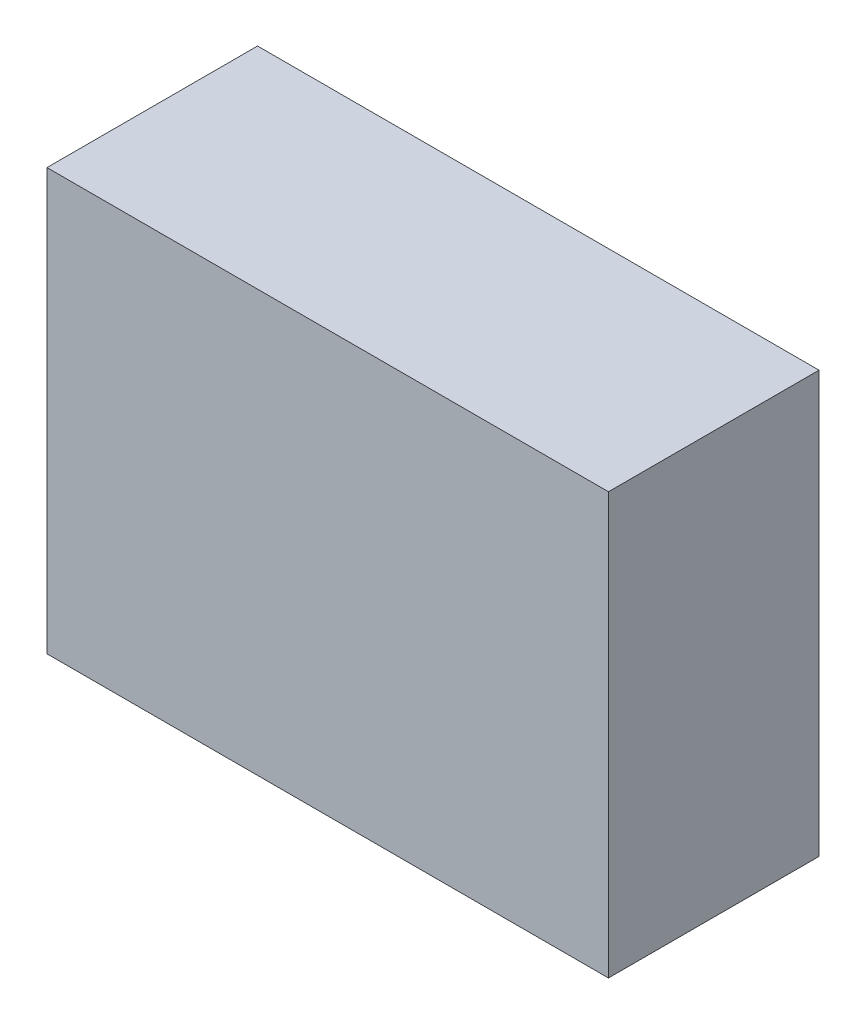
ISO-10303-21;
HEADER;
FILE_DESCRIPTION(('STEP AP214'),'2;1');
FILE_NAME('part.step','',(''),(''),'','','');
FILE_SCHEMA(('AUTOMOTIVE_DESIGN { 1 0 10303 214 1 1 1 1 }'));
ENDSEC;
DATA;
#1=APPLICATION_CONTEXT('core data for automotive mechanical design processes');
#2=APPLICATION_PROTOCOL_DEFINITION('international standard','automotive_design',2000,#1);
#3=PRODUCT_CONTEXT('',#1,'mechanical');
#4=PRODUCT('Part','Part','',(#3));
#5=PRODUCT_RELATED_PRODUCT_CATEGORY('part','',(#4));
#6=PRODUCT_DEFINITION_FORMATION('','',#4);
#7=PRODUCT_DEFINITION_CONTEXT('part definition',#1,'design');
#8=PRODUCT_DEFINITION('design','',#6,#7);
#9=PRODUCT_DEFINITION_SHAPE('','',#8);
#10=(LENGTH_UNIT() NAMED_UNIT(*) SI_UNIT(.MILLI.,.METRE.));
#11=(NAMED_UNIT(*) PLANE_ANGLE_UNIT() SI_UNIT($,.RADIAN.));
#12=(NAMED_UNIT(*) SI_UNIT($,.STERADIAN.) SOLID_ANGLE_UNIT());
#13=UNCERTAINTY_MEASURE_WITH_UNIT(LENGTH_MEASURE(1.E-05),#10,'distance_accuracy_value','');
#14=(GEOMETRIC_REPRESENTATION_CONTEXT(3) GLOBAL_UNCERTAINTY_ASSIGNED_CONTEXT((#13)) GLOBAL_UNIT_ASSIGNED_CONTEXT((#10,
#11,#12)) REPRESENTATION_CONTEXT('',''));
#15=CARTESIAN_POINT('',(0.,0.,0.));
#16=DIRECTION('',(0.,0.,1.));
#17=DIRECTION('',(1.,0.,0.));
#18=AXIS2_PLACEMENT_3D('',#15,#16,#17);
#19=CARTESIAN_POINT('',(4000.,-3000.,3000.));
#20=DIRECTION('',(-1.,0.,0.));
#21=DIRECTION('',(0.,0.,1.));
#22=AXIS2_PLACEMENT_3D('',#19,#20,#21);
#23=PLANE('',#22);
#24=DIRECTION('',(0.,1.,0.));
#25=VECTOR('',#24,1.);
#26=CARTESIAN_POINT('',(4000.,-3000.,0.));
#27=LINE('',#26,#25);
#28=CARTESIAN_POINT('',(4000.,-3000.,0.));
#29=VERTEX_POINT('',#28);
#30=CARTESIAN_POINT('',(4000.,3000.,0.));
#31=VERTEX_POINT('',#30);
#32=EDGE_CURVE('E104',#29,#31,#27,.T.);
#33=ORIENTED_EDGE('',*,*,#32,.T.);
#34=DIRECTION('',(0.,0.,-1.));
#35=VECTOR('',#34,1.);
#36=CARTESIAN_POINT('',(4000.,3000.,3000.));
#37=LINE('',#36,#35);
#38=CARTESIAN_POINT('',(4000.,3000.,3000.));
#39=VERTEX_POINT('',#38);
#40=EDGE_CURVE('E11',#39,#31,#37,.T.);
#41=ORIENTED_EDGE('',*,*,#40,.F.);
#42=DIRECTION('',(0.,1.,0.));
#43=VECTOR('',#42,1.);
#44=CARTESIAN_POINT('',(4000.,-3000.,3000.));
#45=LINE('',#44,#43);
#46=CARTESIAN_POINT('',(4000.,-3000.,3000.));
#47=VERTEX_POINT('',#46);
#48=EDGE_CURVE('E92',#47,#39,#45,.T.);
#49=ORIENTED_EDGE('',*,*,#48,.F.);
#50=DIRECTION('',(0.,0.,-1.));
#51=VECTOR('',#50,1.);
#52=CARTESIAN_POINT('',(4000.,-3000.,3000.));
#53=LINE('',#52,#51);
#54=EDGE_CURVE('E100',#47,#29,#53,.T.);
#55=ORIENTED_EDGE('',*,*,#54,.T.);
#56=EDGE_LOOP('',(#33,#41,#49,#55));
#57=FACE_BOUND('',#56,.T.);
#58=ADVANCED_FACE('F41',(#57),#23,.F.);
#59=CARTESIAN_POINT('',(-4000.,3000.,3000.));
#60=DIRECTION('',(0.,-1.,0.));
#61=DIRECTION('',(0.,0.,-1.));
#62=AXIS2_PLACEMENT_3D('',#59,#60,#61);
#63=PLANE('',#62);
#64=DIRECTION('',(-1.,0.,0.));
#65=VECTOR('',#64,1.);
#66=CARTESIAN_POINT('',(-4000.,3000.,0.));
#67=LINE('',#66,#65);
#68=CARTESIAN_POINT('',(-4000.,3000.,0.));
#69=VERTEX_POINT('',#68);
#70=EDGE_CURVE('E96',#31,#69,#67,.T.);
#71=ORIENTED_EDGE('',*,*,#70,.T.);
#72=DIRECTION('',(0.,0.,-1.));
#73=VECTOR('',#72,1.);
#74=CARTESIAN_POINT('',(-4000.,3000.,3000.));
#75=LINE('',#74,#73);
#76=CARTESIAN_POINT('',(-4000.,3000.,3000.));
#77=VERTEX_POINT('',#76);
#78=EDGE_CURVE('E49',#77,#69,#75,.T.);
#79=ORIENTED_EDGE('',*,*,#78,.F.);
#80=DIRECTION('',(-1.,0.,0.));
#81=VECTOR('',#80,1.);
#82=CARTESIAN_POINT('',(-4000.,3000.,3000.));
#83=LINE('',#82,#81);
#84=EDGE_CURVE('E87',#39,#77,#83,.T.);
#85=ORIENTED_EDGE('',*,*,#84,.F.);
#86=ORIENTED_EDGE('',*,*,#40,.T.);
#87=EDGE_LOOP('',(#71,#79,#85,#86));
#88=FACE_BOUND('',#87,.T.);
#89=ADVANCED_FACE('F95',(#88),#63,.F.);
#90=CARTESIAN_POINT('',(-4000.,-3000.,3000.));
#91=DIRECTION('',(1.,0.,0.));
#92=DIRECTION('',(0.,0.,-1.));
#93=AXIS2_PLACEMENT_3D('',#90,#91,#92);
#94=PLANE('',#93);
#95=DIRECTION('',(0.,-1.,0.));
#96=VECTOR('',#95,1.);
#97=CARTESIAN_POINT('',(-4000.,-3000.,0.));
#98=LINE('',#97,#96);
#99=CARTESIAN_POINT('',(-4000.,-3000.,0.));
#100=VERTEX_POINT('',#99);
#101=EDGE_CURVE('E74',#69,#100,#98,.T.);
#102=ORIENTED_EDGE('',*,*,#101,.T.);
#103=DIRECTION('',(0.,0.,-1.));
#104=VECTOR('',#103,1.);
#105=CARTESIAN_POINT('',(-4000.,-3000.,3000.));
#106=LINE('',#105,#104);
#107=CARTESIAN_POINT('',(-4000.,-3000.,3000.));
#108=VERTEX_POINT('',#107);
#109=EDGE_CURVE('E97',#108,#100,#106,.T.);
#110=ORIENTED_EDGE('',*,*,#109,.F.);
#111=DIRECTION('',(0.,-1.,0.));
#112=VECTOR('',#111,1.);
#113=CARTESIAN_POINT('',(-4000.,-3000.,3000.));
#114=LINE('',#113,#112);
#115=EDGE_CURVE('E90',#77,#108,#114,.T.);
#116=ORIENTED_EDGE('',*,*,#115,.F.);
#117=ORIENTED_EDGE('',*,*,#78,.T.);
#118=EDGE_LOOP('',(#102,#110,#116,#117));
#119=FACE_BOUND('',#118,.T.);
#120=ADVANCED_FACE('F98',(#119),#94,.F.);
#121=CARTESIAN_POINT('',(-4000.,-3000.,3000.));
#122=DIRECTION('',(0.,1.,0.));
#123=DIRECTION('',(0.,0.,1.));
#124=AXIS2_PLACEMENT_3D('',#121,#122,#123);
#125=PLANE('',#124);
#126=DIRECTION('',(1.,0.,0.));
#127=VECTOR('',#126,1.);
#128=CARTESIAN_POINT('',(-4000.,-3000.,0.));
#129=LINE('',#128,#127);
#130=EDGE_CURVE('E80',#100,#29,#129,.T.);
#131=ORIENTED_EDGE('',*,*,#130,.T.);
#132=ORIENTED_EDGE('',*,*,#54,.F.);
#133=DIRECTION('',(1.,0.,0.));
#134=VECTOR('',#133,1.);
#135=CARTESIAN_POINT('',(-4000.,-3000.,3000.));
#136=LINE('',#135,#134);
#137=EDGE_CURVE('E57',#108,#47,#136,.T.);
#138=ORIENTED_EDGE('',*,*,#137,.F.);
#139=ORIENTED_EDGE('',*,*,#109,.T.);
#140=EDGE_LOOP('',(#131,#132,#138,#139));
#141=FACE_BOUND('',#140,.T.);
#142=ADVANCED_FACE('F111',(#141),#125,.F.);
#143=CARTESIAN_POINT('',(0.,0.,3000.));
#144=DIRECTION('',(0.,0.,-1.));
#145=DIRECTION('',(-1.,0.,0.));
#146=AXIS2_PLACEMENT_3D('',#143,#144,#145);
#147=PLANE('',#146);
#148=ORIENTED_EDGE('',*,*,#48,.T.);
#149=ORIENTED_EDGE('',*,*,#84,.T.);
#150=ORIENTED_EDGE('',*,*,#115,.T.);
#151=ORIENTED_EDGE('',*,*,#137,.T.);
#152=EDGE_LOOP('',(#148,#149,#150,#151));
#153=FACE_BOUND('',#152,.T.);
#154=ADVANCED_FACE('F88',(#153),#147,.F.);
#155=CARTESIAN_POINT('',(0.,0.,0.));
#156=DIRECTION('',(0.,0.,-1.));
#157=DIRECTION('',(-1.,0.,0.));
#158=AXIS2_PLACEMENT_3D('',#155,#156,#157);
#159=PLANE('',#158);
#160=ORIENTED_EDGE('',*,*,#32,.F.);
#161=ORIENTED_EDGE('',*,*,#130,.F.);
#162=ORIENTED_EDGE('',*,*,#101,.F.);
#163=ORIENTED_EDGE('',*,*,#70,.F.);
#164=EDGE_LOOP('',(#160,#161,#162,#163));
#165=FACE_BOUND('',#164,.T.);
#166=ADVANCED_FACE('F114',(#165),#159,.T.);
#167=CLOSED_SHELL('',(#58,#89,#120,#142,#154,#166));
#168=MANIFOLD_SOLID_BREP('B2',#167);
#169=ADVANCED_BREP_SHAPE_REPRESENTATION('',(#18,#168),#14);
#170=SHAPE_DEFINITION_REPRESENTATION(#9,#169);
ENDSEC;
END-ISO-10303-21;
